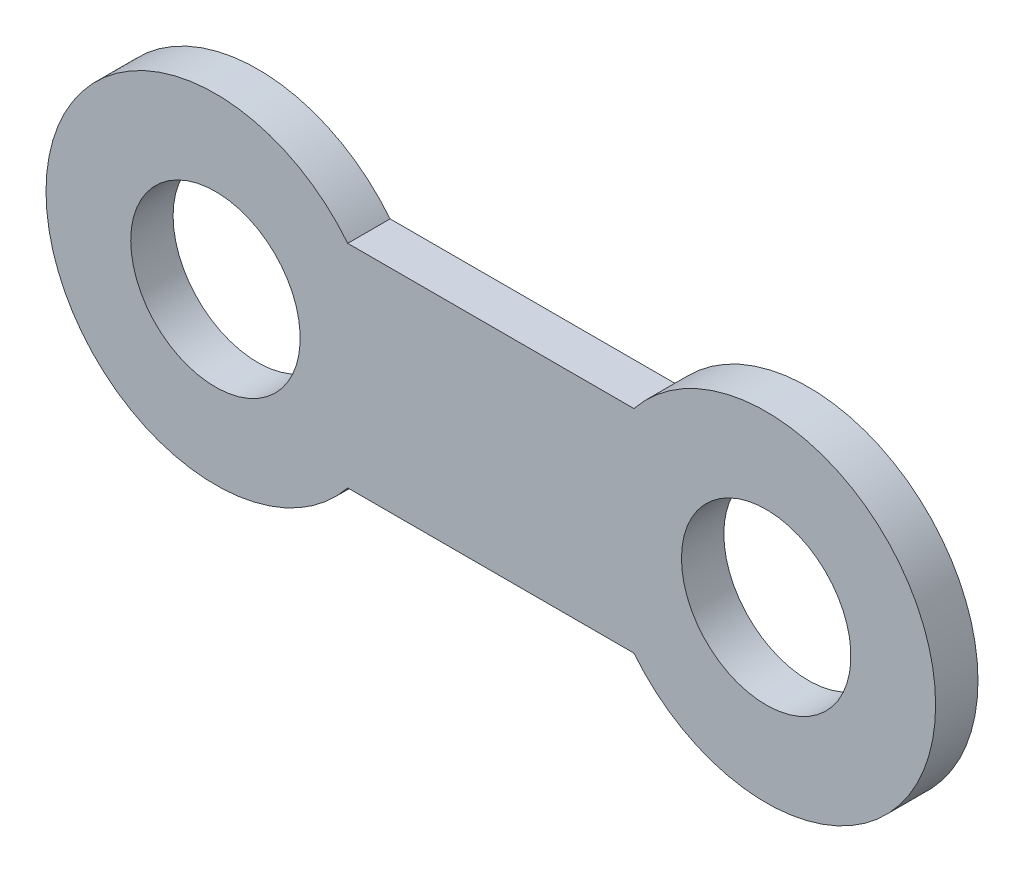
ISO-10303-21;
HEADER;
FILE_DESCRIPTION(('STEP AP214'),'2;1');
FILE_NAME('part.step','',(''),(''),'','','');
FILE_SCHEMA(('AUTOMOTIVE_DESIGN { 1 0 10303 214 1 1 1 1 }'));
ENDSEC;
DATA;
#1=APPLICATION_CONTEXT('core data for automotive mechanical design processes');
#2=APPLICATION_PROTOCOL_DEFINITION('international standard','automotive_design',2000,#1);
#3=PRODUCT_CONTEXT('',#1,'mechanical');
#4=PRODUCT('Part','Part','',(#3));
#5=PRODUCT_RELATED_PRODUCT_CATEGORY('part','',(#4));
#6=PRODUCT_DEFINITION_FORMATION('','',#4);
#7=PRODUCT_DEFINITION_CONTEXT('part definition',#1,'design');
#8=PRODUCT_DEFINITION('design','',#6,#7);
#9=PRODUCT_DEFINITION_SHAPE('','',#8);
#10=(LENGTH_UNIT() NAMED_UNIT(*) SI_UNIT(.MILLI.,.METRE.));
#11=(NAMED_UNIT(*) PLANE_ANGLE_UNIT() SI_UNIT($,.RADIAN.));
#12=(NAMED_UNIT(*) SI_UNIT($,.STERADIAN.) SOLID_ANGLE_UNIT());
#13=UNCERTAINTY_MEASURE_WITH_UNIT(LENGTH_MEASURE(1.E-05),#10,'distance_accuracy_value','');
#14=(GEOMETRIC_REPRESENTATION_CONTEXT(3) GLOBAL_UNCERTAINTY_ASSIGNED_CONTEXT((#13)) GLOBAL_UNIT_ASSIGNED_CONTEXT((#10,
#11,#12)) REPRESENTATION_CONTEXT('',''));
#15=CARTESIAN_POINT('',(0.,0.,0.));
#16=DIRECTION('',(0.,0.,1.));
#17=DIRECTION('',(1.,0.,0.));
#18=AXIS2_PLACEMENT_3D('',#15,#16,#17);
#19=CARTESIAN_POINT('',(-42.5,12.5,5.));
#20=DIRECTION('',(0.,-1.,0.));
#21=DIRECTION('',(0.,0.,-1.));
#22=AXIS2_PLACEMENT_3D('',#19,#20,#21);
#23=PLANE('',#22);
#24=DIRECTION('',(-1.,0.,0.));
#25=VECTOR('',#24,1.);
#26=CARTESIAN_POINT('',(-42.5,12.5,0.));
#27=LINE('',#26,#25);
#28=CARTESIAN_POINT('',(16.887505004004,12.5,0.));
#29=VERTEX_POINT('',#28);
#30=CARTESIAN_POINT('',(-16.887505004004,12.5,0.));
#31=VERTEX_POINT('',#30);
#32=EDGE_CURVE('E87',#29,#31,#27,.T.);
#33=ORIENTED_EDGE('',*,*,#32,.T.);
#34=DIRECTION('',(0.,0.,1.));
#35=VECTOR('',#34,1.);
#36=CARTESIAN_POINT('',(-16.887505004004,12.5,-56.5685424949238));
#37=LINE('',#36,#35);
#38=CARTESIAN_POINT('',(-16.887505004004,12.5,5.));
#39=VERTEX_POINT('',#38);
#40=EDGE_CURVE('E77',#31,#39,#37,.T.);
#41=ORIENTED_EDGE('',*,*,#40,.T.);
#42=DIRECTION('',(-1.,0.,0.));
#43=VECTOR('',#42,1.);
#44=CARTESIAN_POINT('',(-42.5,12.5,5.));
#45=LINE('',#44,#43);
#46=CARTESIAN_POINT('',(16.887505004004,12.5,5.));
#47=VERTEX_POINT('',#46);
#48=EDGE_CURVE('E43',#47,#39,#45,.T.);
#49=ORIENTED_EDGE('',*,*,#48,.F.);
#50=DIRECTION('',(0.,0.,1.));
#51=VECTOR('',#50,1.);
#52=CARTESIAN_POINT('',(16.887505004004,12.5,-56.5685424949238));
#53=LINE('',#52,#51);
#54=EDGE_CURVE('E93',#47,#29,#53,.F.);
#55=ORIENTED_EDGE('',*,*,#54,.T.);
#56=EDGE_LOOP('',(#33,#41,#49,#55));
#57=FACE_BOUND('',#56,.T.);
#58=ADVANCED_FACE('F35',(#57),#23,.F.);
#59=CARTESIAN_POINT('',(-42.5,-12.5,5.));
#60=DIRECTION('',(0.,1.,0.));
#61=DIRECTION('',(0.,0.,1.));
#62=AXIS2_PLACEMENT_3D('',#59,#60,#61);
#63=PLANE('',#62);
#64=DIRECTION('',(1.,0.,0.));
#65=VECTOR('',#64,1.);
#66=CARTESIAN_POINT('',(-42.5,-12.5,5.));
#67=LINE('',#66,#65);
#68=CARTESIAN_POINT('',(-16.887505004004,-12.5,5.));
#69=VERTEX_POINT('',#68);
#70=CARTESIAN_POINT('',(16.887505004004,-12.5,5.));
#71=VERTEX_POINT('',#70);
#72=EDGE_CURVE('E11',#69,#71,#67,.T.);
#73=ORIENTED_EDGE('',*,*,#72,.F.);
#74=DIRECTION('',(0.,0.,1.));
#75=VECTOR('',#74,1.);
#76=CARTESIAN_POINT('',(-16.887505004004,-12.5,-56.5685424949238));
#77=LINE('',#76,#75);
#78=CARTESIAN_POINT('',(-16.887505004004,-12.5,0.));
#79=VERTEX_POINT('',#78);
#80=EDGE_CURVE('E78',#69,#79,#77,.F.);
#81=ORIENTED_EDGE('',*,*,#80,.T.);
#82=DIRECTION('',(1.,0.,0.));
#83=VECTOR('',#82,1.);
#84=CARTESIAN_POINT('',(-42.5,-12.5,0.));
#85=LINE('',#84,#83);
#86=CARTESIAN_POINT('',(16.887505004004,-12.5,0.));
#87=VERTEX_POINT('',#86);
#88=EDGE_CURVE('E38',#79,#87,#85,.T.);
#89=ORIENTED_EDGE('',*,*,#88,.T.);
#90=DIRECTION('',(0.,0.,1.));
#91=VECTOR('',#90,1.);
#92=CARTESIAN_POINT('',(16.887505004004,-12.5,-56.5685424949238));
#93=LINE('',#92,#91);
#94=EDGE_CURVE('E95',#87,#71,#93,.T.);
#95=ORIENTED_EDGE('',*,*,#94,.T.);
#96=EDGE_LOOP('',(#73,#81,#89,#95));
#97=FACE_BOUND('',#96,.T.);
#98=ADVANCED_FACE('F129',(#97),#63,.F.);
#99=CARTESIAN_POINT('',(0.,0.,5.));
#100=DIRECTION('',(0.,0.,-1.));
#101=DIRECTION('',(-1.,0.,0.));
#102=AXIS2_PLACEMENT_3D('',#99,#100,#101);
#103=PLANE('',#102);
#104=CARTESIAN_POINT('',(32.5,0.,5.));
#105=DIRECTION('',(0.,0.,-1.));
#106=DIRECTION('',(-1.,0.,0.));
#107=AXIS2_PLACEMENT_3D('',#104,#105,#106);
#108=CIRCLE('',#107,10.);
#109=CARTESIAN_POINT('',(22.5,0.,5.));
#110=VERTEX_POINT('',#109);
#111=EDGE_CURVE('E80',#110,#110,#108,.T.);
#112=ORIENTED_EDGE('',*,*,#111,.T.);
#113=EDGE_LOOP('',(#112));
#114=FACE_BOUND('',#113,.T.);
#115=CARTESIAN_POINT('',(-32.5,0.,5.));
#116=DIRECTION('',(0.,0.,-1.));
#117=DIRECTION('',(-1.,0.,0.));
#118=AXIS2_PLACEMENT_3D('',#115,#116,#117);
#119=CIRCLE('',#118,10.);
#120=CARTESIAN_POINT('',(-42.5,0.,5.));
#121=VERTEX_POINT('',#120);
#122=EDGE_CURVE('E107',#121,#121,#119,.T.);
#123=ORIENTED_EDGE('',*,*,#122,.T.);
#124=EDGE_LOOP('',(#123));
#125=FACE_BOUND('',#124,.T.);
#126=ORIENTED_EDGE('',*,*,#48,.T.);
#127=CARTESIAN_POINT('',(-32.5,0.,5.));
#128=DIRECTION('',(0.,0.,1.));
#129=DIRECTION('',(1.,0.,0.));
#130=AXIS2_PLACEMENT_3D('',#127,#128,#129);
#131=CIRCLE('',#130,20.);
#132=EDGE_CURVE('E74',#39,#69,#131,.T.);
#133=ORIENTED_EDGE('',*,*,#132,.T.);
#134=ORIENTED_EDGE('',*,*,#72,.T.);
#135=CARTESIAN_POINT('',(32.5,0.,5.));
#136=DIRECTION('',(0.,0.,1.));
#137=DIRECTION('',(1.,0.,0.));
#138=AXIS2_PLACEMENT_3D('',#135,#136,#137);
#139=CIRCLE('',#138,20.);
#140=EDGE_CURVE('E88',#71,#47,#139,.T.);
#141=ORIENTED_EDGE('',*,*,#140,.T.);
#142=EDGE_LOOP('',(#126,#133,#134,#141));
#143=FACE_BOUND('',#142,.T.);
#144=ADVANCED_FACE('F90',(#114,#125,#143),#103,.F.);
#145=CARTESIAN_POINT('',(0.,0.,0.));
#146=DIRECTION('',(0.,0.,-1.));
#147=DIRECTION('',(-1.,0.,0.));
#148=AXIS2_PLACEMENT_3D('',#145,#146,#147);
#149=PLANE('',#148);
#150=CARTESIAN_POINT('',(32.5,0.,0.));
#151=DIRECTION('',(0.,0.,-1.));
#152=DIRECTION('',(-1.,0.,0.));
#153=AXIS2_PLACEMENT_3D('',#150,#151,#152);
#154=CIRCLE('',#153,10.);
#155=CARTESIAN_POINT('',(22.5,0.,0.));
#156=VERTEX_POINT('',#155);
#157=EDGE_CURVE('E110',#156,#156,#154,.T.);
#158=ORIENTED_EDGE('',*,*,#157,.F.);
#159=EDGE_LOOP('',(#158));
#160=FACE_BOUND('',#159,.T.);
#161=CARTESIAN_POINT('',(-32.5,0.,0.));
#162=DIRECTION('',(0.,0.,-1.));
#163=DIRECTION('',(-1.,0.,0.));
#164=AXIS2_PLACEMENT_3D('',#161,#162,#163);
#165=CIRCLE('',#164,10.);
#166=CARTESIAN_POINT('',(-42.5,0.,0.));
#167=VERTEX_POINT('',#166);
#168=EDGE_CURVE('E111',#167,#167,#165,.T.);
#169=ORIENTED_EDGE('',*,*,#168,.F.);
#170=EDGE_LOOP('',(#169));
#171=FACE_BOUND('',#170,.T.);
#172=ORIENTED_EDGE('',*,*,#88,.F.);
#173=CARTESIAN_POINT('',(-32.5,0.,0.));
#174=DIRECTION('',(0.,0.,-1.));
#175=DIRECTION('',(-1.,0.,0.));
#176=AXIS2_PLACEMENT_3D('',#173,#174,#175);
#177=CIRCLE('',#176,20.);
#178=EDGE_CURVE('E51',#31,#79,#177,.F.);
#179=ORIENTED_EDGE('',*,*,#178,.F.);
#180=ORIENTED_EDGE('',*,*,#32,.F.);
#181=CARTESIAN_POINT('',(32.5,0.,0.));
#182=DIRECTION('',(0.,0.,-1.));
#183=DIRECTION('',(-1.,0.,0.));
#184=AXIS2_PLACEMENT_3D('',#181,#182,#183);
#185=CIRCLE('',#184,20.);
#186=EDGE_CURVE('E97',#87,#29,#185,.F.);
#187=ORIENTED_EDGE('',*,*,#186,.F.);
#188=EDGE_LOOP('',(#172,#179,#180,#187));
#189=FACE_BOUND('',#188,.T.);
#190=ADVANCED_FACE('F120',(#160,#171,#189),#149,.T.);
#191=CARTESIAN_POINT('',(32.5,0.,-56.5685424949238));
#192=DIRECTION('',(0.,0.,1.));
#193=DIRECTION('',(1.,0.,0.));
#194=AXIS2_PLACEMENT_3D('',#191,#192,#193);
#195=CYLINDRICAL_SURFACE('',#194,20.);
#196=ORIENTED_EDGE('',*,*,#54,.F.);
#197=ORIENTED_EDGE('',*,*,#140,.F.);
#198=ORIENTED_EDGE('',*,*,#94,.F.);
#199=ORIENTED_EDGE('',*,*,#186,.T.);
#200=EDGE_LOOP('',(#196,#197,#198,#199));
#201=FACE_BOUND('',#200,.T.);
#202=ADVANCED_FACE('F123',(#201),#195,.T.);
#203=CARTESIAN_POINT('',(-32.5,0.,-56.5685424949238));
#204=DIRECTION('',(0.,0.,1.));
#205=DIRECTION('',(1.,0.,0.));
#206=AXIS2_PLACEMENT_3D('',#203,#204,#205);
#207=CYLINDRICAL_SURFACE('',#206,20.);
#208=ORIENTED_EDGE('',*,*,#40,.F.);
#209=ORIENTED_EDGE('',*,*,#178,.T.);
#210=ORIENTED_EDGE('',*,*,#80,.F.);
#211=ORIENTED_EDGE('',*,*,#132,.F.);
#212=EDGE_LOOP('',(#208,#209,#210,#211));
#213=FACE_BOUND('',#212,.T.);
#214=ADVANCED_FACE('F76',(#213),#207,.T.);
#215=CARTESIAN_POINT('',(-32.5,0.,35.));
#216=DIRECTION('',(0.,0.,-1.));
#217=DIRECTION('',(-1.,0.,0.));
#218=AXIS2_PLACEMENT_3D('',#215,#216,#217);
#219=CYLINDRICAL_SURFACE('',#218,10.);
#220=ORIENTED_EDGE('',*,*,#168,.T.);
#221=EDGE_LOOP('',(#220));
#222=FACE_BOUND('',#221,.T.);
#223=ORIENTED_EDGE('',*,*,#122,.F.);
#224=EDGE_LOOP('',(#223));
#225=FACE_BOUND('',#224,.T.);
#226=ADVANCED_FACE('F136',(#222,#225),#219,.F.);
#227=CARTESIAN_POINT('',(32.5,0.,35.));
#228=DIRECTION('',(0.,0.,-1.));
#229=DIRECTION('',(-1.,0.,0.));
#230=AXIS2_PLACEMENT_3D('',#227,#228,#229);
#231=CYLINDRICAL_SURFACE('',#230,10.);
#232=ORIENTED_EDGE('',*,*,#157,.T.);
#233=EDGE_LOOP('',(#232));
#234=FACE_BOUND('',#233,.T.);
#235=ORIENTED_EDGE('',*,*,#111,.F.);
#236=EDGE_LOOP('',(#235));
#237=FACE_BOUND('',#236,.T.);
#238=ADVANCED_FACE('F117',(#234,#237),#231,.F.);
#239=CLOSED_SHELL('',(#58,#98,#144,#190,#202,#214,#226,#238));
#240=MANIFOLD_SOLID_BREP('B2',#239);
#241=ADVANCED_BREP_SHAPE_REPRESENTATION('',(#18,#240),#14);
#242=SHAPE_DEFINITION_REPRESENTATION(#9,#241);
ENDSEC;
END-ISO-10303-21;
